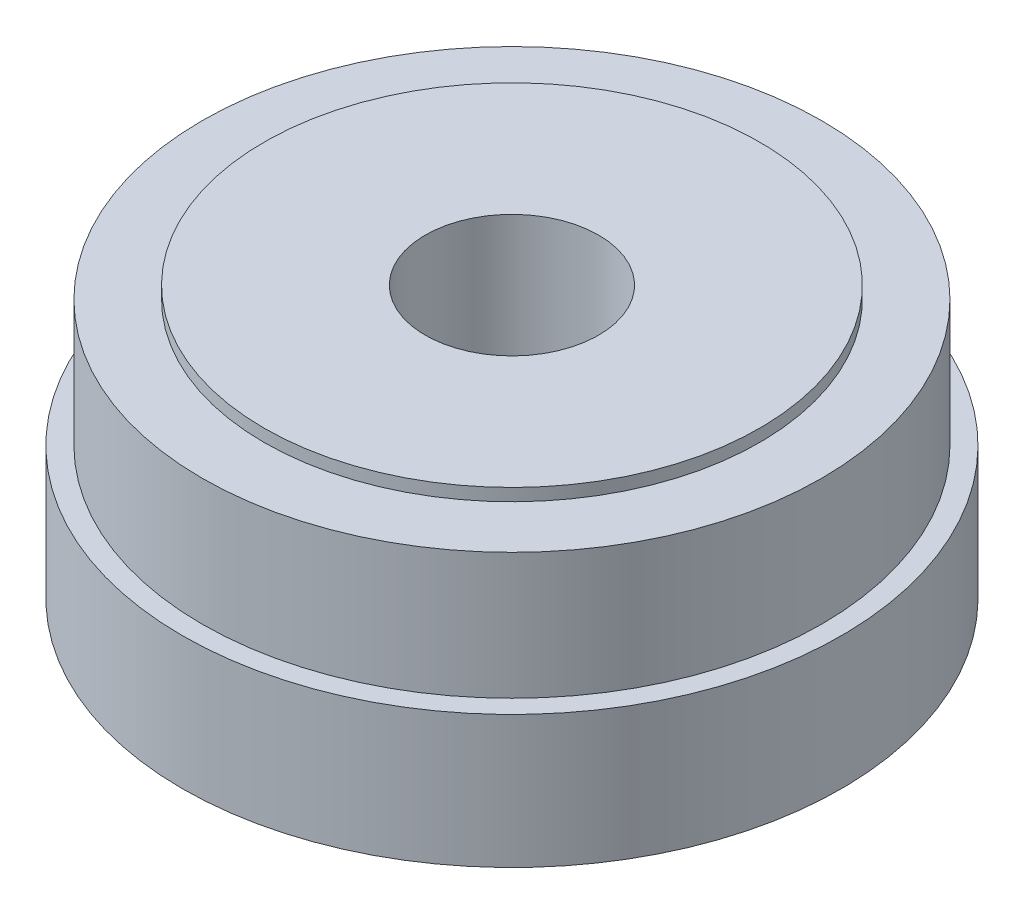
ISO-10303-21;
HEADER;
FILE_DESCRIPTION(('STEP AP214'),'2;1');
FILE_NAME('part.step','',(''),(''),'','','');
FILE_SCHEMA(('AUTOMOTIVE_DESIGN { 1 0 10303 214 1 1 1 1 }'));
ENDSEC;
DATA;
#1=APPLICATION_CONTEXT('core data for automotive mechanical design processes');
#2=APPLICATION_PROTOCOL_DEFINITION('international standard','automotive_design',2000,#1);
#3=PRODUCT_CONTEXT('',#1,'mechanical');
#4=PRODUCT('Part','Part','',(#3));
#5=PRODUCT_RELATED_PRODUCT_CATEGORY('part','',(#4));
#6=PRODUCT_DEFINITION_FORMATION('','',#4);
#7=PRODUCT_DEFINITION_CONTEXT('part definition',#1,'design');
#8=PRODUCT_DEFINITION('design','',#6,#7);
#9=PRODUCT_DEFINITION_SHAPE('','',#8);
#10=(LENGTH_UNIT() NAMED_UNIT(*) SI_UNIT(.MILLI.,.METRE.));
#11=(NAMED_UNIT(*) PLANE_ANGLE_UNIT() SI_UNIT($,.RADIAN.));
#12=(NAMED_UNIT(*) SI_UNIT($,.STERADIAN.) SOLID_ANGLE_UNIT());
#13=UNCERTAINTY_MEASURE_WITH_UNIT(LENGTH_MEASURE(1.E-05),#10,'distance_accuracy_value','');
#14=(GEOMETRIC_REPRESENTATION_CONTEXT(3) GLOBAL_UNCERTAINTY_ASSIGNED_CONTEXT((#13)) GLOBAL_UNIT_ASSIGNED_CONTEXT((#10,
#11,#12)) REPRESENTATION_CONTEXT('',''));
#15=CARTESIAN_POINT('',(0.,0.,0.));
#16=DIRECTION('',(0.,0.,1.));
#17=DIRECTION('',(1.,0.,0.));
#18=AXIS2_PLACEMENT_3D('',#15,#16,#17);
#19=CARTESIAN_POINT('',(0.,53.5,0.));
#20=DIRECTION('',(0.,-1.,0.));
#21=DIRECTION('',(0.,0.,-1.));
#22=AXIS2_PLACEMENT_3D('',#19,#20,#21);
#23=CYLINDRICAL_SURFACE('',#22,133.);
#24=CARTESIAN_POINT('',(0.,53.5,0.));
#25=DIRECTION('',(0.,1.,0.));
#26=DIRECTION('',(0.,0.,1.));
#27=AXIS2_PLACEMENT_3D('',#24,#25,#26);
#28=CIRCLE('',#27,133.);
#29=CARTESIAN_POINT('',(0.,53.5,133.));
#30=VERTEX_POINT('',#29);
#31=EDGE_CURVE('E65',#30,#30,#28,.T.);
#32=ORIENTED_EDGE('',*,*,#31,.F.);
#33=EDGE_LOOP('',(#32));
#34=FACE_BOUND('',#33,.T.);
#35=CARTESIAN_POINT('',(0.,0.,0.));
#36=DIRECTION('',(0.,1.,0.));
#37=DIRECTION('',(0.,0.,1.));
#38=AXIS2_PLACEMENT_3D('',#35,#36,#37);
#39=CIRCLE('',#38,133.);
#40=CARTESIAN_POINT('',(0.,0.,133.));
#41=VERTEX_POINT('',#40);
#42=EDGE_CURVE('E37',#41,#41,#39,.T.);
#43=ORIENTED_EDGE('',*,*,#42,.T.);
#44=EDGE_LOOP('',(#43));
#45=FACE_BOUND('',#44,.T.);
#46=ADVANCED_FACE('F34',(#34,#45),#23,.T.);
#47=CARTESIAN_POINT('',(0.,53.5,0.));
#48=DIRECTION('',(0.,1.,0.));
#49=DIRECTION('',(0.,0.,1.));
#50=AXIS2_PLACEMENT_3D('',#47,#48,#49);
#51=PLANE('',#50);
#52=CARTESIAN_POINT('',(0.,53.5,0.));
#53=DIRECTION('',(0.,1.,0.));
#54=DIRECTION('',(0.,0.,1.));
#55=AXIS2_PLACEMENT_3D('',#52,#53,#54);
#56=CIRCLE('',#55,125.);
#57=CARTESIAN_POINT('',(0.,53.5,125.));
#58=VERTEX_POINT('',#57);
#59=EDGE_CURVE('E61',#58,#58,#56,.T.);
#60=ORIENTED_EDGE('',*,*,#59,.F.);
#61=EDGE_LOOP('',(#60));
#62=FACE_BOUND('',#61,.T.);
#63=ORIENTED_EDGE('',*,*,#31,.T.);
#64=EDGE_LOOP('',(#63));
#65=FACE_BOUND('',#64,.T.);
#66=ADVANCED_FACE('F76',(#62,#65),#51,.T.);
#67=CARTESIAN_POINT('',(0.,0.,0.));
#68=DIRECTION('',(0.,1.,0.));
#69=DIRECTION('',(0.,0.,1.));
#70=AXIS2_PLACEMENT_3D('',#67,#68,#69);
#71=PLANE('',#70);
#72=CARTESIAN_POINT('',(0.,0.,0.));
#73=DIRECTION('',(0.,-1.,0.));
#74=DIRECTION('',(0.,0.,-1.));
#75=AXIS2_PLACEMENT_3D('',#72,#73,#74);
#76=CIRCLE('',#75,106.);
#77=CARTESIAN_POINT('',(0.,0.,-106.));
#78=VERTEX_POINT('',#77);
#79=EDGE_CURVE('E41',#78,#78,#76,.T.);
#80=ORIENTED_EDGE('',*,*,#79,.F.);
#81=EDGE_LOOP('',(#80));
#82=FACE_BOUND('',#81,.T.);
#83=ORIENTED_EDGE('',*,*,#42,.F.);
#84=EDGE_LOOP('',(#83));
#85=FACE_BOUND('',#84,.T.);
#86=ADVANCED_FACE('F73',(#82,#85),#71,.F.);
#87=CARTESIAN_POINT('',(0.,104.5,0.));
#88=DIRECTION('',(0.,-1.,0.));
#89=DIRECTION('',(0.,0.,-1.));
#90=AXIS2_PLACEMENT_3D('',#87,#88,#89);
#91=CYLINDRICAL_SURFACE('',#90,125.);
#92=CARTESIAN_POINT('',(0.,104.5,0.));
#93=DIRECTION('',(0.,1.,0.));
#94=DIRECTION('',(0.,0.,1.));
#95=AXIS2_PLACEMENT_3D('',#92,#93,#94);
#96=CIRCLE('',#95,125.);
#97=CARTESIAN_POINT('',(0.,104.5,125.));
#98=VERTEX_POINT('',#97);
#99=EDGE_CURVE('E58',#98,#98,#96,.T.);
#100=ORIENTED_EDGE('',*,*,#99,.F.);
#101=EDGE_LOOP('',(#100));
#102=FACE_BOUND('',#101,.T.);
#103=ORIENTED_EDGE('',*,*,#59,.T.);
#104=EDGE_LOOP('',(#103));
#105=FACE_BOUND('',#104,.T.);
#106=ADVANCED_FACE('F75',(#102,#105),#91,.T.);
#107=CARTESIAN_POINT('',(0.,104.5,0.));
#108=DIRECTION('',(0.,1.,0.));
#109=DIRECTION('',(0.,0.,1.));
#110=AXIS2_PLACEMENT_3D('',#107,#108,#109);
#111=PLANE('',#110);
#112=CARTESIAN_POINT('',(0.,104.5,0.));
#113=DIRECTION('',(0.,1.,0.));
#114=DIRECTION('',(0.,0.,1.));
#115=AXIS2_PLACEMENT_3D('',#112,#113,#114);
#116=CIRCLE('',#115,100.);
#117=CARTESIAN_POINT('',(0.,104.5,100.));
#118=VERTEX_POINT('',#117);
#119=EDGE_CURVE('E46',#118,#118,#116,.T.);
#120=ORIENTED_EDGE('',*,*,#119,.F.);
#121=EDGE_LOOP('',(#120));
#122=FACE_BOUND('',#121,.T.);
#123=ORIENTED_EDGE('',*,*,#99,.T.);
#124=EDGE_LOOP('',(#123));
#125=FACE_BOUND('',#124,.T.);
#126=ADVANCED_FACE('F82',(#122,#125),#111,.T.);
#127=CARTESIAN_POINT('',(0.,109.5,0.));
#128=DIRECTION('',(0.,-1.,0.));
#129=DIRECTION('',(0.,0.,-1.));
#130=AXIS2_PLACEMENT_3D('',#127,#128,#129);
#131=CYLINDRICAL_SURFACE('',#130,100.);
#132=CARTESIAN_POINT('',(0.,109.5,0.));
#133=DIRECTION('',(0.,1.,0.));
#134=DIRECTION('',(0.,0.,1.));
#135=AXIS2_PLACEMENT_3D('',#132,#133,#134);
#136=CIRCLE('',#135,100.);
#137=CARTESIAN_POINT('',(0.,109.5,100.));
#138=VERTEX_POINT('',#137);
#139=EDGE_CURVE('E54',#138,#138,#136,.T.);
#140=ORIENTED_EDGE('',*,*,#139,.F.);
#141=EDGE_LOOP('',(#140));
#142=FACE_BOUND('',#141,.T.);
#143=ORIENTED_EDGE('',*,*,#119,.T.);
#144=EDGE_LOOP('',(#143));
#145=FACE_BOUND('',#144,.T.);
#146=ADVANCED_FACE('F112',(#142,#145),#131,.T.);
#147=CARTESIAN_POINT('',(0.,109.5,0.));
#148=DIRECTION('',(0.,1.,0.));
#149=DIRECTION('',(0.,0.,1.));
#150=AXIS2_PLACEMENT_3D('',#147,#148,#149);
#151=PLANE('',#150);
#152=CARTESIAN_POINT('',(0.,109.5,0.));
#153=DIRECTION('',(0.,-1.,0.));
#154=DIRECTION('',(0.,0.,-1.));
#155=AXIS2_PLACEMENT_3D('',#152,#153,#154);
#156=CIRCLE('',#155,35.);
#157=CARTESIAN_POINT('',(0.,109.5,-35.));
#158=VERTEX_POINT('',#157);
#159=EDGE_CURVE('E192',#158,#158,#156,.T.);
#160=ORIENTED_EDGE('',*,*,#159,.T.);
#161=EDGE_LOOP('',(#160));
#162=FACE_BOUND('',#161,.T.);
#163=ORIENTED_EDGE('',*,*,#139,.T.);
#164=EDGE_LOOP('',(#163));
#165=FACE_BOUND('',#164,.T.);
#166=ADVANCED_FACE('F121',(#162,#165),#151,.T.);
#167=CARTESIAN_POINT('',(0.,-12.,0.));
#168=DIRECTION('',(0.,1.,0.));
#169=DIRECTION('',(0.,0.,1.));
#170=AXIS2_PLACEMENT_3D('',#167,#168,#169);
#171=CYLINDRICAL_SURFACE('',#170,106.);
#172=CARTESIAN_POINT('',(0.,-12.,0.));
#173=DIRECTION('',(0.,-1.,0.));
#174=DIRECTION('',(0.,0.,-1.));
#175=AXIS2_PLACEMENT_3D('',#172,#173,#174);
#176=CIRCLE('',#175,106.);
#177=CARTESIAN_POINT('',(0.,-12.,-106.));
#178=VERTEX_POINT('',#177);
#179=EDGE_CURVE('E52',#178,#178,#176,.T.);
#180=ORIENTED_EDGE('',*,*,#179,.F.);
#181=EDGE_LOOP('',(#180));
#182=FACE_BOUND('',#181,.T.);
#183=ORIENTED_EDGE('',*,*,#79,.T.);
#184=EDGE_LOOP('',(#183));
#185=FACE_BOUND('',#184,.T.);
#186=ADVANCED_FACE('F133',(#182,#185),#171,.T.);
#187=CARTESIAN_POINT('',(0.,-12.,0.));
#188=DIRECTION('',(0.,-1.,0.));
#189=DIRECTION('',(0.,0.,-1.));
#190=AXIS2_PLACEMENT_3D('',#187,#188,#189);
#191=PLANE('',#190);
#192=CARTESIAN_POINT('',(0.,-12.,0.));
#193=DIRECTION('',(0.,-1.,0.));
#194=DIRECTION('',(0.,0.,-1.));
#195=AXIS2_PLACEMENT_3D('',#192,#193,#194);
#196=CIRCLE('',#195,60.);
#197=CARTESIAN_POINT('',(0.,-12.,-60.));
#198=VERTEX_POINT('',#197);
#199=EDGE_CURVE('E10',#198,#198,#196,.T.);
#200=ORIENTED_EDGE('',*,*,#199,.F.);
#201=EDGE_LOOP('',(#200));
#202=FACE_BOUND('',#201,.T.);
#203=ORIENTED_EDGE('',*,*,#179,.T.);
#204=EDGE_LOOP('',(#203));
#205=FACE_BOUND('',#204,.T.);
#206=ADVANCED_FACE('F138',(#202,#205),#191,.T.);
#207=CARTESIAN_POINT('',(0.,-23.,0.));
#208=DIRECTION('',(0.,1.,0.));
#209=DIRECTION('',(0.,0.,1.));
#210=AXIS2_PLACEMENT_3D('',#207,#208,#209);
#211=CYLINDRICAL_SURFACE('',#210,60.);
#212=CARTESIAN_POINT('',(0.,-23.,0.));
#213=DIRECTION('',(0.,-1.,0.));
#214=DIRECTION('',(0.,0.,-1.));
#215=AXIS2_PLACEMENT_3D('',#212,#213,#214);
#216=CIRCLE('',#215,60.);
#217=CARTESIAN_POINT('',(0.,-23.,-60.));
#218=VERTEX_POINT('',#217);
#219=EDGE_CURVE('E50',#218,#218,#216,.T.);
#220=ORIENTED_EDGE('',*,*,#219,.F.);
#221=EDGE_LOOP('',(#220));
#222=FACE_BOUND('',#221,.T.);
#223=ORIENTED_EDGE('',*,*,#199,.T.);
#224=EDGE_LOOP('',(#223));
#225=FACE_BOUND('',#224,.T.);
#226=ADVANCED_FACE('F148',(#222,#225),#211,.T.);
#227=CARTESIAN_POINT('',(0.,-23.,0.));
#228=DIRECTION('',(0.,-1.,0.));
#229=DIRECTION('',(0.,0.,-1.));
#230=AXIS2_PLACEMENT_3D('',#227,#228,#229);
#231=PLANE('',#230);
#232=CARTESIAN_POINT('',(0.,-23.,0.));
#233=DIRECTION('',(0.,-1.,0.));
#234=DIRECTION('',(0.,0.,-1.));
#235=AXIS2_PLACEMENT_3D('',#232,#233,#234);
#236=CIRCLE('',#235,35.);
#237=CARTESIAN_POINT('',(0.,-23.,-35.));
#238=VERTEX_POINT('',#237);
#239=EDGE_CURVE('E195',#238,#238,#236,.T.);
#240=ORIENTED_EDGE('',*,*,#239,.F.);
#241=EDGE_LOOP('',(#240));
#242=FACE_BOUND('',#241,.T.);
#243=ORIENTED_EDGE('',*,*,#219,.T.);
#244=EDGE_LOOP('',(#243));
#245=FACE_BOUND('',#244,.T.);
#246=ADVANCED_FACE('F158',(#242,#245),#231,.T.);
#247=CARTESIAN_POINT('',(0.,109.5,0.));
#248=DIRECTION('',(0.,-1.,0.));
#249=DIRECTION('',(0.,0.,-1.));
#250=AXIS2_PLACEMENT_3D('',#247,#248,#249);
#251=CYLINDRICAL_SURFACE('',#250,35.);
#252=ORIENTED_EDGE('',*,*,#159,.F.);
#253=EDGE_LOOP('',(#252));
#254=FACE_BOUND('',#253,.T.);
#255=ORIENTED_EDGE('',*,*,#239,.T.);
#256=EDGE_LOOP('',(#255));
#257=FACE_BOUND('',#256,.T.);
#258=ADVANCED_FACE('F175',(#254,#257),#251,.F.);
#259=CLOSED_SHELL('',(#46,#66,#86,#106,#126,#146,#166,#186,#206,#226,#246,#258));
#260=MANIFOLD_SOLID_BREP('B2',#259);
#261=ADVANCED_BREP_SHAPE_REPRESENTATION('',(#18,#260),#14);
#262=SHAPE_DEFINITION_REPRESENTATION(#9,#261);
ENDSEC;
END-ISO-10303-21;
